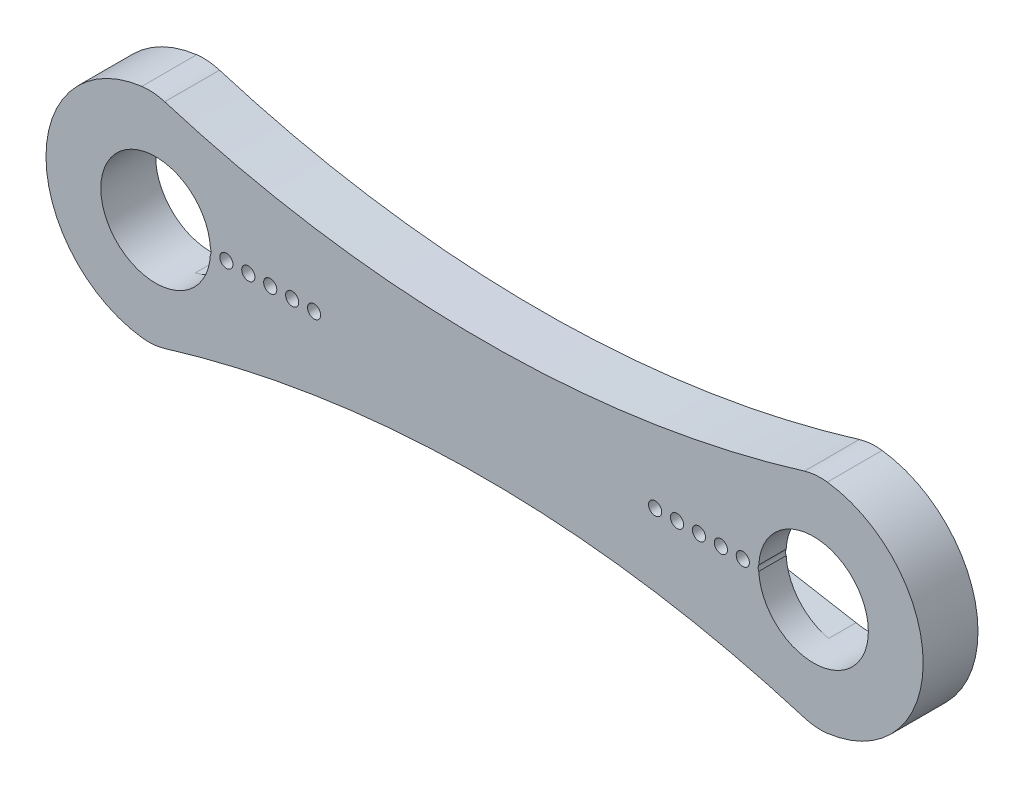
ISO-10303-21;
HEADER;
FILE_DESCRIPTION(('STEP AP214'),'2;1');
FILE_NAME('part.step','',(''),(''),'','','');
FILE_SCHEMA(('AUTOMOTIVE_DESIGN { 1 0 10303 214 1 1 1 1 }'));
ENDSEC;
DATA;
#1=APPLICATION_CONTEXT('core data for automotive mechanical design processes');
#2=APPLICATION_PROTOCOL_DEFINITION('international standard','automotive_design',2000,#1);
#3=PRODUCT_CONTEXT('',#1,'mechanical');
#4=PRODUCT('Part','Part','',(#3));
#5=PRODUCT_RELATED_PRODUCT_CATEGORY('part','',(#4));
#6=PRODUCT_DEFINITION_FORMATION('','',#4);
#7=PRODUCT_DEFINITION_CONTEXT('part definition',#1,'design');
#8=PRODUCT_DEFINITION('design','',#6,#7);
#9=PRODUCT_DEFINITION_SHAPE('','',#8);
#10=(LENGTH_UNIT() NAMED_UNIT(*) SI_UNIT(.MILLI.,.METRE.));
#11=(NAMED_UNIT(*) PLANE_ANGLE_UNIT() SI_UNIT($,.RADIAN.));
#12=(NAMED_UNIT(*) SI_UNIT($,.STERADIAN.) SOLID_ANGLE_UNIT());
#13=UNCERTAINTY_MEASURE_WITH_UNIT(LENGTH_MEASURE(1.E-05),#10,'distance_accuracy_value','');
#14=(GEOMETRIC_REPRESENTATION_CONTEXT(3) GLOBAL_UNCERTAINTY_ASSIGNED_CONTEXT((#13)) GLOBAL_UNIT_ASSIGNED_CONTEXT((#10,
#11,#12)) REPRESENTATION_CONTEXT('',''));
#15=CARTESIAN_POINT('',(0.,0.,0.));
#16=DIRECTION('',(0.,0.,1.));
#17=DIRECTION('',(1.,0.,0.));
#18=AXIS2_PLACEMENT_3D('',#15,#16,#17);
#19=CARTESIAN_POINT('',(60.,0.,5.));
#20=DIRECTION('',(0.,0.,-1.));
#21=DIRECTION('',(-1.,0.,0.));
#22=AXIS2_PLACEMENT_3D('',#19,#20,#21);
#23=CYLINDRICAL_SURFACE('',#22,5.);
#24=DIRECTION('',(0.,0.,-1.));
#25=VECTOR('',#24,1.);
#26=CARTESIAN_POINT('',(55.0064606741573,0.254096440868885,2.5));
#27=LINE('',#26,#25);
#28=CARTESIAN_POINT('',(55.0064606741573,0.254096440868886,5.));
#29=VERTEX_POINT('',#28);
#30=CARTESIAN_POINT('',(55.0064606741573,0.254096440868885,2.5));
#31=VERTEX_POINT('',#30);
#32=EDGE_CURVE('E11',#29,#31,#27,.T.);
#33=ORIENTED_EDGE('',*,*,#32,.T.);
#34=CARTESIAN_POINT('',(60.,0.,2.5));
#35=DIRECTION('',(0.,0.,-1.));
#36=DIRECTION('',(-1.,0.,0.));
#37=AXIS2_PLACEMENT_3D('',#34,#35,#36);
#38=CIRCLE('',#37,5.);
#39=CARTESIAN_POINT('',(59.134948096886,4.92460000456063,2.5));
#40=VERTEX_POINT('',#39);
#41=EDGE_CURVE('E55',#31,#40,#38,.T.);
#42=ORIENTED_EDGE('',*,*,#41,.T.);
#43=DIRECTION('',(0.,0.,-1.));
#44=VECTOR('',#43,1.);
#45=CARTESIAN_POINT('',(59.134948096886,4.92460000456063,2.5));
#46=LINE('',#45,#44);
#47=CARTESIAN_POINT('',(59.134948096886,4.92460000456063,0.));
#48=VERTEX_POINT('',#47);
#49=EDGE_CURVE('E179',#40,#48,#46,.T.);
#50=ORIENTED_EDGE('',*,*,#49,.T.);
#51=CARTESIAN_POINT('',(60.,0.,0.));
#52=DIRECTION('',(0.,0.,1.));
#53=DIRECTION('',(1.,0.,0.));
#54=AXIS2_PLACEMENT_3D('',#51,#52,#53);
#55=CIRCLE('',#54,5.);
#56=CARTESIAN_POINT('',(58.8754325259518,-4.8718936766223,0.));
#57=VERTEX_POINT('',#56);
#58=EDGE_CURVE('E297',#57,#48,#55,.T.);
#59=ORIENTED_EDGE('',*,*,#58,.F.);
#60=DIRECTION('',(0.,0.,-1.));
#61=VECTOR('',#60,1.);
#62=CARTESIAN_POINT('',(58.8754325259518,-4.8718936766223,2.5));
#63=LINE('',#62,#61);
#64=CARTESIAN_POINT('',(58.8754325259518,-4.8718936766223,2.5));
#65=VERTEX_POINT('',#64);
#66=EDGE_CURVE('E187',#65,#57,#63,.T.);
#67=ORIENTED_EDGE('',*,*,#66,.F.);
#68=CARTESIAN_POINT('',(55.0064606741575,-0.254096440869342,2.5));
#69=VERTEX_POINT('',#68);
#70=EDGE_CURVE('E201',#65,#69,#38,.T.);
#71=ORIENTED_EDGE('',*,*,#70,.T.);
#72=DIRECTION('',(0.,0.,-1.));
#73=VECTOR('',#72,1.);
#74=CARTESIAN_POINT('',(55.0064606741573,-0.254096440868886,2.5));
#75=LINE('',#74,#73);
#76=CARTESIAN_POINT('',(55.0064606741573,-0.254096440868887,5.));
#77=VERTEX_POINT('',#76);
#78=EDGE_CURVE('E48',#69,#77,#75,.F.);
#79=ORIENTED_EDGE('',*,*,#78,.T.);
#80=CARTESIAN_POINT('',(60.,0.,5.));
#81=DIRECTION('',(0.,0.,1.));
#82=DIRECTION('',(1.,0.,0.));
#83=AXIS2_PLACEMENT_3D('',#80,#81,#82);
#84=CIRCLE('',#83,5.);
#85=EDGE_CURVE('E318',#77,#29,#84,.T.);
#86=ORIENTED_EDGE('',*,*,#85,.T.);
#87=EDGE_LOOP('',(#33,#42,#50,#59,#67,#71,#79,#86));
#88=FACE_BOUND('',#87,.T.);
#89=ADVANCED_FACE('F39',(#88),#23,.F.);
#90=CARTESIAN_POINT('',(55.5500000000002,0.,5.));
#91=DIRECTION('',(0.,0.,-1.));
#92=DIRECTION('',(-1.,0.,0.));
#93=AXIS2_PLACEMENT_3D('',#90,#91,#92);
#94=CYLINDRICAL_SURFACE('',#93,0.6);
#95=ORIENTED_EDGE('',*,*,#78,.F.);
#96=CARTESIAN_POINT('',(55.5500000000002,0.,2.5));
#97=DIRECTION('',(0.,0.,1.));
#98=DIRECTION('',(1.,0.,0.));
#99=AXIS2_PLACEMENT_3D('',#96,#97,#98);
#100=CIRCLE('',#99,0.6);
#101=EDGE_CURVE('E542',#69,#31,#100,.F.);
#102=ORIENTED_EDGE('',*,*,#101,.T.);
#103=ORIENTED_EDGE('',*,*,#32,.F.);
#104=CARTESIAN_POINT('',(55.5500000000002,0.,5.));
#105=DIRECTION('',(0.,0.,1.));
#106=DIRECTION('',(1.,0.,0.));
#107=AXIS2_PLACEMENT_3D('',#104,#105,#106);
#108=CIRCLE('',#107,0.6);
#109=EDGE_CURVE('E211',#29,#77,#108,.T.);
#110=ORIENTED_EDGE('',*,*,#109,.T.);
#111=EDGE_LOOP('',(#95,#102,#103,#110));
#112=FACE_BOUND('',#111,.T.);
#113=ADVANCED_FACE('F465',(#112),#94,.F.);
#114=CARTESIAN_POINT('',(45.5500000000002,0.,5.));
#115=DIRECTION('',(0.,0.,-1.));
#116=DIRECTION('',(-1.,0.,0.));
#117=AXIS2_PLACEMENT_3D('',#114,#115,#116);
#118=CYLINDRICAL_SURFACE('',#117,0.6);
#119=CARTESIAN_POINT('',(45.5500000000002,0.,5.));
#120=DIRECTION('',(0.,0.,1.));
#121=DIRECTION('',(1.,0.,0.));
#122=AXIS2_PLACEMENT_3D('',#119,#120,#121);
#123=CIRCLE('',#122,0.6);
#124=CARTESIAN_POINT('',(46.1500000000002,0.,5.));
#125=VERTEX_POINT('',#124);
#126=EDGE_CURVE('E200',#125,#125,#123,.T.);
#127=ORIENTED_EDGE('',*,*,#126,.T.);
#128=EDGE_LOOP('',(#127));
#129=FACE_BOUND('',#128,.T.);
#130=CARTESIAN_POINT('',(45.5500000000002,0.,2.5));
#131=DIRECTION('',(0.,0.,1.));
#132=DIRECTION('',(1.,0.,0.));
#133=AXIS2_PLACEMENT_3D('',#130,#131,#132);
#134=CIRCLE('',#133,0.6);
#135=CARTESIAN_POINT('',(46.1500000000002,0.,2.5));
#136=VERTEX_POINT('',#135);
#137=EDGE_CURVE('E188',#136,#136,#134,.F.);
#138=ORIENTED_EDGE('',*,*,#137,.T.);
#139=EDGE_LOOP('',(#138));
#140=FACE_BOUND('',#139,.T.);
#141=ADVANCED_FACE('F470',(#129,#140),#118,.F.);
#142=CARTESIAN_POINT('',(47.5500000000002,0.,5.));
#143=DIRECTION('',(0.,0.,-1.));
#144=DIRECTION('',(-1.,0.,0.));
#145=AXIS2_PLACEMENT_3D('',#142,#143,#144);
#146=CYLINDRICAL_SURFACE('',#145,0.6);
#147=CARTESIAN_POINT('',(47.5500000000002,0.,5.));
#148=DIRECTION('',(0.,0.,1.));
#149=DIRECTION('',(1.,0.,0.));
#150=AXIS2_PLACEMENT_3D('',#147,#148,#149);
#151=CIRCLE('',#150,0.6);
#152=CARTESIAN_POINT('',(48.1500000000002,0.,5.));
#153=VERTEX_POINT('',#152);
#154=EDGE_CURVE('E206',#153,#153,#151,.T.);
#155=ORIENTED_EDGE('',*,*,#154,.T.);
#156=EDGE_LOOP('',(#155));
#157=FACE_BOUND('',#156,.T.);
#158=CARTESIAN_POINT('',(47.5500000000002,0.,2.5));
#159=DIRECTION('',(0.,0.,1.));
#160=DIRECTION('',(1.,0.,0.));
#161=AXIS2_PLACEMENT_3D('',#158,#159,#160);
#162=CIRCLE('',#161,0.6);
#163=CARTESIAN_POINT('',(48.1500000000002,0.,2.5));
#164=VERTEX_POINT('',#163);
#165=EDGE_CURVE('E559',#164,#164,#162,.F.);
#166=ORIENTED_EDGE('',*,*,#165,.T.);
#167=EDGE_LOOP('',(#166));
#168=FACE_BOUND('',#167,.T.);
#169=ADVANCED_FACE('F612',(#157,#168),#146,.F.);
#170=CARTESIAN_POINT('',(49.5500000000002,0.,5.));
#171=DIRECTION('',(0.,0.,-1.));
#172=DIRECTION('',(-1.,0.,0.));
#173=AXIS2_PLACEMENT_3D('',#170,#171,#172);
#174=CYLINDRICAL_SURFACE('',#173,0.6);
#175=CARTESIAN_POINT('',(49.5500000000002,0.,5.));
#176=DIRECTION('',(0.,0.,1.));
#177=DIRECTION('',(1.,0.,0.));
#178=AXIS2_PLACEMENT_3D('',#175,#176,#177);
#179=CIRCLE('',#178,0.6);
#180=CARTESIAN_POINT('',(50.1500000000002,0.,5.));
#181=VERTEX_POINT('',#180);
#182=EDGE_CURVE('E223',#181,#181,#179,.T.);
#183=ORIENTED_EDGE('',*,*,#182,.T.);
#184=EDGE_LOOP('',(#183));
#185=FACE_BOUND('',#184,.T.);
#186=CARTESIAN_POINT('',(49.5500000000002,0.,2.5));
#187=DIRECTION('',(0.,0.,1.));
#188=DIRECTION('',(1.,0.,0.));
#189=AXIS2_PLACEMENT_3D('',#186,#187,#188);
#190=CIRCLE('',#189,0.6);
#191=CARTESIAN_POINT('',(50.1500000000002,0.,2.5));
#192=VERTEX_POINT('',#191);
#193=EDGE_CURVE('E545',#192,#192,#190,.F.);
#194=ORIENTED_EDGE('',*,*,#193,.T.);
#195=EDGE_LOOP('',(#194));
#196=FACE_BOUND('',#195,.T.);
#197=ADVANCED_FACE('F608',(#185,#196),#174,.F.);
#198=CARTESIAN_POINT('',(51.5500000000002,0.,5.));
#199=DIRECTION('',(0.,0.,-1.));
#200=DIRECTION('',(-1.,0.,0.));
#201=AXIS2_PLACEMENT_3D('',#198,#199,#200);
#202=CYLINDRICAL_SURFACE('',#201,0.6);
#203=CARTESIAN_POINT('',(51.5500000000002,0.,5.));
#204=DIRECTION('',(0.,0.,1.));
#205=DIRECTION('',(1.,0.,0.));
#206=AXIS2_PLACEMENT_3D('',#203,#204,#205);
#207=CIRCLE('',#206,0.6);
#208=CARTESIAN_POINT('',(52.1500000000002,0.,5.));
#209=VERTEX_POINT('',#208);
#210=EDGE_CURVE('E219',#209,#209,#207,.T.);
#211=ORIENTED_EDGE('',*,*,#210,.T.);
#212=EDGE_LOOP('',(#211));
#213=FACE_BOUND('',#212,.T.);
#214=CARTESIAN_POINT('',(51.5500000000002,0.,2.5));
#215=DIRECTION('',(0.,0.,1.));
#216=DIRECTION('',(1.,0.,0.));
#217=AXIS2_PLACEMENT_3D('',#214,#215,#216);
#218=CIRCLE('',#217,0.6);
#219=CARTESIAN_POINT('',(52.1500000000002,0.,2.5));
#220=VERTEX_POINT('',#219);
#221=EDGE_CURVE('E550',#220,#220,#218,.F.);
#222=ORIENTED_EDGE('',*,*,#221,.T.);
#223=EDGE_LOOP('',(#222));
#224=FACE_BOUND('',#223,.T.);
#225=ADVANCED_FACE('F604',(#213,#224),#202,.F.);
#226=CARTESIAN_POINT('',(53.5500000000002,0.,5.));
#227=DIRECTION('',(0.,0.,-1.));
#228=DIRECTION('',(-1.,0.,0.));
#229=AXIS2_PLACEMENT_3D('',#226,#227,#228);
#230=CYLINDRICAL_SURFACE('',#229,0.6);
#231=CARTESIAN_POINT('',(53.5500000000002,0.,5.));
#232=DIRECTION('',(0.,0.,1.));
#233=DIRECTION('',(1.,0.,0.));
#234=AXIS2_PLACEMENT_3D('',#231,#232,#233);
#235=CIRCLE('',#234,0.6);
#236=CARTESIAN_POINT('',(54.1500000000002,0.,5.));
#237=VERTEX_POINT('',#236);
#238=EDGE_CURVE('E215',#237,#237,#235,.T.);
#239=ORIENTED_EDGE('',*,*,#238,.T.);
#240=EDGE_LOOP('',(#239));
#241=FACE_BOUND('',#240,.T.);
#242=CARTESIAN_POINT('',(53.5500000000002,0.,2.5));
#243=DIRECTION('',(0.,0.,1.));
#244=DIRECTION('',(1.,0.,0.));
#245=AXIS2_PLACEMENT_3D('',#242,#243,#244);
#246=CIRCLE('',#245,0.6);
#247=CARTESIAN_POINT('',(54.1500000000002,0.,2.5));
#248=VERTEX_POINT('',#247);
#249=EDGE_CURVE('E544',#248,#248,#246,.F.);
#250=ORIENTED_EDGE('',*,*,#249,.T.);
#251=EDGE_LOOP('',(#250));
#252=FACE_BOUND('',#251,.T.);
#253=ADVANCED_FACE('F488',(#241,#252),#230,.F.);
#254=CARTESIAN_POINT('',(45.,52.6969600708473,0.));
#255=DIRECTION('',(0.,0.,1.));
#256=DIRECTION('',(1.,0.,0.));
#257=AXIS2_PLACEMENT_3D('',#254,#255,#256);
#258=PLANE('',#257);
#259=ORIENTED_EDGE('',*,*,#58,.T.);
#260=DIRECTION('',(0.984920000912125,0.173010380622838,0.));
#261=VECTOR('',#260,1.);
#262=CARTESIAN_POINT('',(59.134948096886,4.92460000456063,0.));
#263=LINE('',#262,#261);
#264=CARTESIAN_POINT('',(45.1174740484431,2.46230000228031,0.));
#265=VERTEX_POINT('',#264);
#266=EDGE_CURVE('E183',#265,#48,#263,.T.);
#267=ORIENTED_EDGE('',*,*,#266,.F.);
#268=CARTESIAN_POINT('',(45.5500000000002,0.,0.));
#269=DIRECTION('',(0.,0.,1.));
#270=DIRECTION('',(1.,0.,0.));
#271=AXIS2_PLACEMENT_3D('',#268,#269,#270);
#272=CIRCLE('',#271,2.5);
#273=CARTESIAN_POINT('',(44.987716262976,-2.43594683831115,0.));
#274=VERTEX_POINT('',#273);
#275=EDGE_CURVE('E197',#265,#274,#272,.T.);
#276=ORIENTED_EDGE('',*,*,#275,.T.);
#277=DIRECTION('',(0.984962994587917,-0.172765445886623,0.));
#278=VECTOR('',#277,1.);
#279=CARTESIAN_POINT('',(59.1373957104497,-4.91784280021816,0.));
#280=LINE('',#279,#278);
#281=EDGE_CURVE('E568',#274,#57,#280,.T.);
#282=ORIENTED_EDGE('',*,*,#281,.T.);
#283=EDGE_LOOP('',(#259,#267,#276,#282));
#284=FACE_BOUND('',#283,.T.);
#285=CARTESIAN_POINT('',(30.,105.393920141695,0.));
#286=DIRECTION('',(0.,0.,-1.));
#287=DIRECTION('',(1.,0.,0.));
#288=AXIS2_PLACEMENT_3D('',#285,#286,#287);
#289=CIRCLE('',#288,100.);
#290=CARTESIAN_POINT('',(59.1699040874637,9.74290501102189,0.));
#291=VERTEX_POINT('',#290);
#292=CARTESIAN_POINT('',(0.830095912536532,9.74290501102183,0.));
#293=VERTEX_POINT('',#292);
#294=EDGE_CURVE('E328',#291,#293,#289,.T.);
#295=ORIENTED_EDGE('',*,*,#294,.F.);
#296=CARTESIAN_POINT('',(60.6283992918368,4.96035425448826,0.));
#297=DIRECTION('',(0.,0.,1.));
#298=DIRECTION('',(1.,0.,0.));
#299=AXIS2_PLACEMENT_3D('',#296,#297,#298);
#300=CIRCLE('',#299,5.);
#301=CARTESIAN_POINT('',(61.2567985836737,9.92070850897635,0.));
#302=VERTEX_POINT('',#301);
#303=EDGE_CURVE('E379',#291,#302,#300,.F.);
#304=ORIENTED_EDGE('',*,*,#303,.T.);
#305=CARTESIAN_POINT('',(60.,0.,0.));
#306=DIRECTION('',(0.,0.,1.));
#307=DIRECTION('',(1.,0.,0.));
#308=AXIS2_PLACEMENT_3D('',#305,#306,#307);
#309=CIRCLE('',#308,10.);
#310=CARTESIAN_POINT('',(61.2567985836733,-9.9207085089764,0.));
#311=VERTEX_POINT('',#310);
#312=EDGE_CURVE('E337',#311,#302,#309,.T.);
#313=ORIENTED_EDGE('',*,*,#312,.F.);
#314=CARTESIAN_POINT('',(60.6283992918366,-4.9603542544882,0.));
#315=DIRECTION('',(0.,0.,1.));
#316=DIRECTION('',(1.,0.,0.));
#317=AXIS2_PLACEMENT_3D('',#314,#315,#316);
#318=CIRCLE('',#317,5.);
#319=CARTESIAN_POINT('',(59.1699040874635,-9.74290501102183,0.));
#320=VERTEX_POINT('',#319);
#321=EDGE_CURVE('E376',#311,#320,#318,.F.);
#322=ORIENTED_EDGE('',*,*,#321,.T.);
#323=CARTESIAN_POINT('',(30.,-105.393920141695,0.));
#324=DIRECTION('',(0.,0.,-1.));
#325=DIRECTION('',(-1.,0.,0.));
#326=AXIS2_PLACEMENT_3D('',#323,#324,#325);
#327=CIRCLE('',#326,100.);
#328=CARTESIAN_POINT('',(0.830095912536334,-9.74290501102189,0.));
#329=VERTEX_POINT('',#328);
#330=EDGE_CURVE('E357',#329,#320,#327,.T.);
#331=ORIENTED_EDGE('',*,*,#330,.F.);
#332=CARTESIAN_POINT('',(-0.628399291836847,-4.96035425448826,0.));
#333=DIRECTION('',(0.,0.,1.));
#334=DIRECTION('',(1.,0.,0.));
#335=AXIS2_PLACEMENT_3D('',#332,#333,#334);
#336=CIRCLE('',#335,5.);
#337=CARTESIAN_POINT('',(-1.25679858367367,-9.92070850897635,0.));
#338=VERTEX_POINT('',#337);
#339=EDGE_CURVE('E373',#329,#338,#336,.F.);
#340=ORIENTED_EDGE('',*,*,#339,.T.);
#341=CARTESIAN_POINT('',(0.,0.,0.));
#342=DIRECTION('',(0.,0.,1.));
#343=DIRECTION('',(1.,0.,0.));
#344=AXIS2_PLACEMENT_3D('',#341,#342,#343);
#345=CIRCLE('',#344,10.);
#346=CARTESIAN_POINT('',(-1.25679858367329,9.9207085089764,0.));
#347=VERTEX_POINT('',#346);
#348=EDGE_CURVE('E353',#347,#338,#345,.T.);
#349=ORIENTED_EDGE('',*,*,#348,.F.);
#350=CARTESIAN_POINT('',(-0.628399291836644,4.9603542544882,0.));
#351=DIRECTION('',(0.,0.,1.));
#352=DIRECTION('',(1.,0.,0.));
#353=AXIS2_PLACEMENT_3D('',#350,#351,#352);
#354=CIRCLE('',#353,5.);
#355=EDGE_CURVE('E370',#347,#293,#354,.F.);
#356=ORIENTED_EDGE('',*,*,#355,.T.);
#357=EDGE_LOOP('',(#295,#304,#313,#322,#331,#340,#349,#356));
#358=FACE_BOUND('',#357,.T.);
#359=DIRECTION('',(-0.984920000912125,0.173010380622838,0.));
#360=VECTOR('',#359,1.);
#361=CARTESIAN_POINT('',(0.865051903114188,4.92460000456063,0.));
#362=LINE('',#361,#360);
#363=CARTESIAN_POINT('',(14.8825259515571,2.46230000228031,0.));
#364=VERTEX_POINT('',#363);
#365=CARTESIAN_POINT('',(0.865051903114188,4.92460000456063,0.));
#366=VERTEX_POINT('',#365);
#367=EDGE_CURVE('E214',#364,#366,#362,.T.);
#368=ORIENTED_EDGE('',*,*,#367,.T.);
#369=CARTESIAN_POINT('',(0.,0.,0.));
#370=DIRECTION('',(0.,0.,1.));
#371=DIRECTION('',(1.,0.,0.));
#372=AXIS2_PLACEMENT_3D('',#369,#370,#371);
#373=CIRCLE('',#372,5.);
#374=CARTESIAN_POINT('',(1.12456747404841,-4.8718936766223,0.));
#375=VERTEX_POINT('',#374);
#376=EDGE_CURVE('E321',#366,#375,#373,.T.);
#377=ORIENTED_EDGE('',*,*,#376,.T.);
#378=DIRECTION('',(-0.984962994587917,-0.172765445886623,0.));
#379=VECTOR('',#378,1.);
#380=CARTESIAN_POINT('',(0.862604289550466,-4.91784280021816,0.));
#381=LINE('',#380,#379);
#382=CARTESIAN_POINT('',(15.0122837370242,-2.43594683831115,0.));
#383=VERTEX_POINT('',#382);
#384=EDGE_CURVE('E235',#383,#375,#381,.T.);
#385=ORIENTED_EDGE('',*,*,#384,.F.);
#386=CARTESIAN_POINT('',(14.45,0.,0.));
#387=DIRECTION('',(0.,0.,-1.));
#388=DIRECTION('',(-1.,0.,0.));
#389=AXIS2_PLACEMENT_3D('',#386,#387,#388);
#390=CIRCLE('',#389,2.5);
#391=EDGE_CURVE('E270',#364,#383,#390,.T.);
#392=ORIENTED_EDGE('',*,*,#391,.F.);
#393=EDGE_LOOP('',(#368,#377,#385,#392));
#394=FACE_BOUND('',#393,.T.);
#395=ADVANCED_FACE('F448',(#284,#358,#394),#258,.F.);
#396=CARTESIAN_POINT('',(4.45,0.,5.));
#397=DIRECTION('',(0.,0.,-1.));
#398=DIRECTION('',(-1.,0.,0.));
#399=AXIS2_PLACEMENT_3D('',#396,#397,#398);
#400=CYLINDRICAL_SURFACE('',#399,0.6);
#401=CARTESIAN_POINT('',(4.45,0.,2.5));
#402=DIRECTION('',(0.,0.,-1.));
#403=DIRECTION('',(-1.,0.,0.));
#404=AXIS2_PLACEMENT_3D('',#401,#402,#403);
#405=CIRCLE('',#404,0.6);
#406=CARTESIAN_POINT('',(4.9935393258427,-0.254096440869346,2.5));
#407=VERTEX_POINT('',#406);
#408=CARTESIAN_POINT('',(4.9935393258427,0.254096440869341,2.5));
#409=VERTEX_POINT('',#408);
#410=EDGE_CURVE('E247',#407,#409,#405,.F.);
#411=ORIENTED_EDGE('',*,*,#410,.F.);
#412=DIRECTION('',(0.,0.,-1.));
#413=VECTOR('',#412,1.);
#414=CARTESIAN_POINT('',(4.9935393258427,-0.254096440869346,2.5));
#415=LINE('',#414,#413);
#416=CARTESIAN_POINT('',(4.9935393258427,-0.254096440869342,5.));
#417=VERTEX_POINT('',#416);
#418=EDGE_CURVE('E419',#407,#417,#415,.F.);
#419=ORIENTED_EDGE('',*,*,#418,.T.);
#420=CARTESIAN_POINT('',(4.45,0.,5.));
#421=DIRECTION('',(0.,0.,-1.));
#422=DIRECTION('',(-1.,0.,0.));
#423=AXIS2_PLACEMENT_3D('',#420,#421,#422);
#424=CIRCLE('',#423,0.6);
#425=CARTESIAN_POINT('',(4.9935393258427,0.254096440869341,5.));
#426=VERTEX_POINT('',#425);
#427=EDGE_CURVE('E293',#426,#417,#424,.T.);
#428=ORIENTED_EDGE('',*,*,#427,.F.);
#429=DIRECTION('',(0.,0.,-1.));
#430=VECTOR('',#429,1.);
#431=CARTESIAN_POINT('',(4.9935393258427,0.254096440869345,2.5));
#432=LINE('',#431,#430);
#433=EDGE_CURVE('E415',#426,#409,#432,.T.);
#434=ORIENTED_EDGE('',*,*,#433,.T.);
#435=EDGE_LOOP('',(#411,#419,#428,#434));
#436=FACE_BOUND('',#435,.T.);
#437=ADVANCED_FACE('F434',(#436),#400,.F.);
#438=CARTESIAN_POINT('',(14.45,0.,5.));
#439=DIRECTION('',(0.,0.,-1.));
#440=DIRECTION('',(-1.,0.,0.));
#441=AXIS2_PLACEMENT_3D('',#438,#439,#440);
#442=CYLINDRICAL_SURFACE('',#441,0.6);
#443=CARTESIAN_POINT('',(14.45,0.,5.));
#444=DIRECTION('',(0.,0.,-1.));
#445=DIRECTION('',(-1.,0.,0.));
#446=AXIS2_PLACEMENT_3D('',#443,#444,#445);
#447=CIRCLE('',#446,0.6);
#448=CARTESIAN_POINT('',(13.85,0.,5.));
#449=VERTEX_POINT('',#448);
#450=EDGE_CURVE('E314',#449,#449,#447,.T.);
#451=ORIENTED_EDGE('',*,*,#450,.F.);
#452=EDGE_LOOP('',(#451));
#453=FACE_BOUND('',#452,.T.);
#454=CARTESIAN_POINT('',(14.45,0.,2.5));
#455=DIRECTION('',(0.,0.,-1.));
#456=DIRECTION('',(-1.,0.,0.));
#457=AXIS2_PLACEMENT_3D('',#454,#455,#456);
#458=CIRCLE('',#457,0.6);
#459=CARTESIAN_POINT('',(13.85,0.,2.5));
#460=VERTEX_POINT('',#459);
#461=EDGE_CURVE('E262',#460,#460,#458,.F.);
#462=ORIENTED_EDGE('',*,*,#461,.F.);
#463=EDGE_LOOP('',(#462));
#464=FACE_BOUND('',#463,.T.);
#465=ADVANCED_FACE('F475',(#453,#464),#442,.F.);
#466=CARTESIAN_POINT('',(12.45,0.,5.));
#467=DIRECTION('',(0.,0.,-1.));
#468=DIRECTION('',(-1.,0.,0.));
#469=AXIS2_PLACEMENT_3D('',#466,#467,#468);
#470=CYLINDRICAL_SURFACE('',#469,0.6);
#471=CARTESIAN_POINT('',(12.45,0.,5.));
#472=DIRECTION('',(0.,0.,-1.));
#473=DIRECTION('',(-1.,0.,0.));
#474=AXIS2_PLACEMENT_3D('',#471,#472,#473);
#475=CIRCLE('',#474,0.6);
#476=CARTESIAN_POINT('',(11.85,0.,5.));
#477=VERTEX_POINT('',#476);
#478=EDGE_CURVE('E310',#477,#477,#475,.T.);
#479=ORIENTED_EDGE('',*,*,#478,.F.);
#480=EDGE_LOOP('',(#479));
#481=FACE_BOUND('',#480,.T.);
#482=CARTESIAN_POINT('',(12.45,0.,2.5));
#483=DIRECTION('',(0.,0.,-1.));
#484=DIRECTION('',(-1.,0.,0.));
#485=AXIS2_PLACEMENT_3D('',#482,#483,#484);
#486=CIRCLE('',#485,0.6);
#487=CARTESIAN_POINT('',(11.85,0.,2.5));
#488=VERTEX_POINT('',#487);
#489=EDGE_CURVE('E258',#488,#488,#486,.F.);
#490=ORIENTED_EDGE('',*,*,#489,.F.);
#491=EDGE_LOOP('',(#490));
#492=FACE_BOUND('',#491,.T.);
#493=ADVANCED_FACE('F759',(#481,#492),#470,.F.);
#494=CARTESIAN_POINT('',(10.45,0.,5.));
#495=DIRECTION('',(0.,0.,-1.));
#496=DIRECTION('',(-1.,0.,0.));
#497=AXIS2_PLACEMENT_3D('',#494,#495,#496);
#498=CYLINDRICAL_SURFACE('',#497,0.6);
#499=CARTESIAN_POINT('',(10.45,0.,5.));
#500=DIRECTION('',(0.,0.,-1.));
#501=DIRECTION('',(-1.,0.,0.));
#502=AXIS2_PLACEMENT_3D('',#499,#500,#501);
#503=CIRCLE('',#502,0.6);
#504=CARTESIAN_POINT('',(9.85,0.,5.));
#505=VERTEX_POINT('',#504);
#506=EDGE_CURVE('E306',#505,#505,#503,.T.);
#507=ORIENTED_EDGE('',*,*,#506,.F.);
#508=EDGE_LOOP('',(#507));
#509=FACE_BOUND('',#508,.T.);
#510=CARTESIAN_POINT('',(10.45,0.,2.5));
#511=DIRECTION('',(0.,0.,-1.));
#512=DIRECTION('',(-1.,0.,0.));
#513=AXIS2_PLACEMENT_3D('',#510,#511,#512);
#514=CIRCLE('',#513,0.6);
#515=CARTESIAN_POINT('',(9.85,0.,2.5));
#516=VERTEX_POINT('',#515);
#517=EDGE_CURVE('E243',#516,#516,#514,.F.);
#518=ORIENTED_EDGE('',*,*,#517,.F.);
#519=EDGE_LOOP('',(#518));
#520=FACE_BOUND('',#519,.T.);
#521=ADVANCED_FACE('F749',(#509,#520),#498,.F.);
#522=CARTESIAN_POINT('',(8.45,0.,5.));
#523=DIRECTION('',(0.,0.,-1.));
#524=DIRECTION('',(-1.,0.,0.));
#525=AXIS2_PLACEMENT_3D('',#522,#523,#524);
#526=CYLINDRICAL_SURFACE('',#525,0.6);
#527=CARTESIAN_POINT('',(8.45,0.,5.));
#528=DIRECTION('',(0.,0.,-1.));
#529=DIRECTION('',(-1.,0.,0.));
#530=AXIS2_PLACEMENT_3D('',#527,#528,#529);
#531=CIRCLE('',#530,0.6);
#532=CARTESIAN_POINT('',(7.85,0.,5.));
#533=VERTEX_POINT('',#532);
#534=EDGE_CURVE('E302',#533,#533,#531,.T.);
#535=ORIENTED_EDGE('',*,*,#534,.F.);
#536=EDGE_LOOP('',(#535));
#537=FACE_BOUND('',#536,.T.);
#538=CARTESIAN_POINT('',(8.45,0.,2.5));
#539=DIRECTION('',(0.,0.,-1.));
#540=DIRECTION('',(-1.,0.,0.));
#541=AXIS2_PLACEMENT_3D('',#538,#539,#540);
#542=CIRCLE('',#541,0.6);
#543=CARTESIAN_POINT('',(7.85,0.,2.5));
#544=VERTEX_POINT('',#543);
#545=EDGE_CURVE('E254',#544,#544,#542,.F.);
#546=ORIENTED_EDGE('',*,*,#545,.F.);
#547=EDGE_LOOP('',(#546));
#548=FACE_BOUND('',#547,.T.);
#549=ADVANCED_FACE('F738',(#537,#548),#526,.F.);
#550=CARTESIAN_POINT('',(6.45,0.,5.));
#551=DIRECTION('',(0.,0.,-1.));
#552=DIRECTION('',(-1.,0.,0.));
#553=AXIS2_PLACEMENT_3D('',#550,#551,#552);
#554=CYLINDRICAL_SURFACE('',#553,0.6);
#555=CARTESIAN_POINT('',(6.45,0.,5.));
#556=DIRECTION('',(0.,0.,-1.));
#557=DIRECTION('',(-1.,0.,0.));
#558=AXIS2_PLACEMENT_3D('',#555,#556,#557);
#559=CIRCLE('',#558,0.6);
#560=CARTESIAN_POINT('',(5.85,0.,5.));
#561=VERTEX_POINT('',#560);
#562=EDGE_CURVE('E298',#561,#561,#559,.T.);
#563=ORIENTED_EDGE('',*,*,#562,.F.);
#564=EDGE_LOOP('',(#563));
#565=FACE_BOUND('',#564,.T.);
#566=CARTESIAN_POINT('',(6.45,0.,2.5));
#567=DIRECTION('',(0.,0.,-1.));
#568=DIRECTION('',(-1.,0.,0.));
#569=AXIS2_PLACEMENT_3D('',#566,#567,#568);
#570=CIRCLE('',#569,0.6);
#571=CARTESIAN_POINT('',(5.85,0.,2.5));
#572=VERTEX_POINT('',#571);
#573=EDGE_CURVE('E250',#572,#572,#570,.F.);
#574=ORIENTED_EDGE('',*,*,#573,.F.);
#575=EDGE_LOOP('',(#574));
#576=FACE_BOUND('',#575,.T.);
#577=ADVANCED_FACE('F484',(#565,#576),#554,.F.);
#578=CARTESIAN_POINT('',(45.,52.6969600708473,5.));
#579=DIRECTION('',(0.,0.,1.));
#580=DIRECTION('',(1.,0.,0.));
#581=AXIS2_PLACEMENT_3D('',#578,#579,#580);
#582=PLANE('',#581);
#583=ORIENTED_EDGE('',*,*,#238,.F.);
#584=EDGE_LOOP('',(#583));
#585=FACE_BOUND('',#584,.T.);
#586=ORIENTED_EDGE('',*,*,#210,.F.);
#587=EDGE_LOOP('',(#586));
#588=FACE_BOUND('',#587,.T.);
#589=ORIENTED_EDGE('',*,*,#182,.F.);
#590=EDGE_LOOP('',(#589));
#591=FACE_BOUND('',#590,.T.);
#592=ORIENTED_EDGE('',*,*,#154,.F.);
#593=EDGE_LOOP('',(#592));
#594=FACE_BOUND('',#593,.T.);
#595=ORIENTED_EDGE('',*,*,#126,.F.);
#596=EDGE_LOOP('',(#595));
#597=FACE_BOUND('',#596,.T.);
#598=ORIENTED_EDGE('',*,*,#427,.T.);
#599=CARTESIAN_POINT('',(0.,0.,5.));
#600=DIRECTION('',(0.,0.,1.));
#601=DIRECTION('',(1.,0.,0.));
#602=AXIS2_PLACEMENT_3D('',#599,#600,#601);
#603=CIRCLE('',#602,5.);
#604=EDGE_CURVE('E324',#426,#417,#603,.T.);
#605=ORIENTED_EDGE('',*,*,#604,.F.);
#606=EDGE_LOOP('',(#598,#605));
#607=FACE_BOUND('',#606,.T.);
#608=ORIENTED_EDGE('',*,*,#562,.T.);
#609=EDGE_LOOP('',(#608));
#610=FACE_BOUND('',#609,.T.);
#611=ORIENTED_EDGE('',*,*,#534,.T.);
#612=EDGE_LOOP('',(#611));
#613=FACE_BOUND('',#612,.T.);
#614=ORIENTED_EDGE('',*,*,#506,.T.);
#615=EDGE_LOOP('',(#614));
#616=FACE_BOUND('',#615,.T.);
#617=ORIENTED_EDGE('',*,*,#478,.T.);
#618=EDGE_LOOP('',(#617));
#619=FACE_BOUND('',#618,.T.);
#620=ORIENTED_EDGE('',*,*,#450,.T.);
#621=EDGE_LOOP('',(#620));
#622=FACE_BOUND('',#621,.T.);
#623=CARTESIAN_POINT('',(60.,0.,5.));
#624=DIRECTION('',(0.,0.,1.));
#625=DIRECTION('',(1.,0.,0.));
#626=AXIS2_PLACEMENT_3D('',#623,#624,#625);
#627=CIRCLE('',#626,10.);
#628=CARTESIAN_POINT('',(61.2567985836733,-9.9207085089764,5.));
#629=VERTEX_POINT('',#628);
#630=CARTESIAN_POINT('',(61.2567985836737,9.92070850897635,5.));
#631=VERTEX_POINT('',#630);
#632=EDGE_CURVE('E345',#629,#631,#627,.T.);
#633=ORIENTED_EDGE('',*,*,#632,.T.);
#634=CARTESIAN_POINT('',(60.6283992918368,4.96035425448826,5.));
#635=DIRECTION('',(0.,0.,1.));
#636=DIRECTION('',(1.,0.,0.));
#637=AXIS2_PLACEMENT_3D('',#634,#635,#636);
#638=CIRCLE('',#637,5.);
#639=CARTESIAN_POINT('',(59.1699040874637,9.74290501102189,5.));
#640=VERTEX_POINT('',#639);
#641=EDGE_CURVE('E398',#631,#640,#638,.T.);
#642=ORIENTED_EDGE('',*,*,#641,.T.);
#643=CARTESIAN_POINT('',(30.,105.393920141695,5.));
#644=DIRECTION('',(0.,0.,-1.));
#645=DIRECTION('',(1.,0.,0.));
#646=AXIS2_PLACEMENT_3D('',#643,#644,#645);
#647=CIRCLE('',#646,100.);
#648=CARTESIAN_POINT('',(0.830095912536532,9.74290501102183,5.));
#649=VERTEX_POINT('',#648);
#650=EDGE_CURVE('E332',#640,#649,#647,.T.);
#651=ORIENTED_EDGE('',*,*,#650,.T.);
#652=CARTESIAN_POINT('',(-0.628399291836644,4.9603542544882,5.));
#653=DIRECTION('',(0.,0.,1.));
#654=DIRECTION('',(1.,0.,0.));
#655=AXIS2_PLACEMENT_3D('',#652,#653,#654);
#656=CIRCLE('',#655,5.);
#657=CARTESIAN_POINT('',(-1.25679858367329,9.9207085089764,5.));
#658=VERTEX_POINT('',#657);
#659=EDGE_CURVE('E389',#649,#658,#656,.T.);
#660=ORIENTED_EDGE('',*,*,#659,.T.);
#661=CARTESIAN_POINT('',(0.,0.,5.));
#662=DIRECTION('',(0.,0.,1.));
#663=DIRECTION('',(1.,0.,0.));
#664=AXIS2_PLACEMENT_3D('',#661,#662,#663);
#665=CIRCLE('',#664,10.);
#666=CARTESIAN_POINT('',(-1.25679858367367,-9.92070850897635,5.));
#667=VERTEX_POINT('',#666);
#668=EDGE_CURVE('E336',#658,#667,#665,.T.);
#669=ORIENTED_EDGE('',*,*,#668,.T.);
#670=CARTESIAN_POINT('',(-0.628399291836847,-4.96035425448826,5.));
#671=DIRECTION('',(0.,0.,1.));
#672=DIRECTION('',(1.,0.,0.));
#673=AXIS2_PLACEMENT_3D('',#670,#671,#672);
#674=CIRCLE('',#673,5.);
#675=CARTESIAN_POINT('',(0.830095912536334,-9.74290501102189,5.));
#676=VERTEX_POINT('',#675);
#677=EDGE_CURVE('E392',#667,#676,#674,.T.);
#678=ORIENTED_EDGE('',*,*,#677,.T.);
#679=CARTESIAN_POINT('',(30.,-105.393920141695,5.));
#680=DIRECTION('',(0.,0.,-1.));
#681=DIRECTION('',(-1.,0.,0.));
#682=AXIS2_PLACEMENT_3D('',#679,#680,#681);
#683=CIRCLE('',#682,100.);
#684=CARTESIAN_POINT('',(59.1699040874635,-9.74290501102183,5.));
#685=VERTEX_POINT('',#684);
#686=EDGE_CURVE('E341',#676,#685,#683,.T.);
#687=ORIENTED_EDGE('',*,*,#686,.T.);
#688=CARTESIAN_POINT('',(60.6283992918366,-4.9603542544882,5.));
#689=DIRECTION('',(0.,0.,1.));
#690=DIRECTION('',(1.,0.,0.));
#691=AXIS2_PLACEMENT_3D('',#688,#689,#690);
#692=CIRCLE('',#691,5.);
#693=EDGE_CURVE('E395',#685,#629,#692,.T.);
#694=ORIENTED_EDGE('',*,*,#693,.T.);
#695=EDGE_LOOP('',(#633,#642,#651,#660,#669,#678,#687,#694));
#696=FACE_BOUND('',#695,.T.);
#697=ORIENTED_EDGE('',*,*,#85,.F.);
#698=ORIENTED_EDGE('',*,*,#109,.F.);
#699=EDGE_LOOP('',(#697,#698));
#700=FACE_BOUND('',#699,.T.);
#701=ADVANCED_FACE('F437',(#585,#588,#591,#594,#597,#607,#610,#613,#616,#619,#622,#696,#700),
#582,.T.);
#702=CARTESIAN_POINT('',(30.,105.393920141695,5.));
#703=DIRECTION('',(0.,0.,-1.));
#704=DIRECTION('',(-1.,0.,0.));
#705=AXIS2_PLACEMENT_3D('',#702,#703,#704);
#706=CYLINDRICAL_SURFACE('',#705,100.);
#707=ORIENTED_EDGE('',*,*,#650,.F.);
#708=DIRECTION('',(0.,0.,-1.));
#709=VECTOR('',#708,1.);
#710=CARTESIAN_POINT('',(59.1699040874637,9.74290501102189,5.));
#711=LINE('',#710,#709);
#712=EDGE_CURVE('E366',#640,#291,#711,.T.);
#713=ORIENTED_EDGE('',*,*,#712,.T.);
#714=ORIENTED_EDGE('',*,*,#294,.T.);
#715=DIRECTION('',(0.,0.,-1.));
#716=VECTOR('',#715,1.);
#717=CARTESIAN_POINT('',(0.830095912536532,9.74290501102183,5.));
#718=LINE('',#717,#716);
#719=EDGE_CURVE('E349',#293,#649,#718,.F.);
#720=ORIENTED_EDGE('',*,*,#719,.T.);
#721=EDGE_LOOP('',(#707,#713,#714,#720));
#722=FACE_BOUND('',#721,.T.);
#723=ADVANCED_FACE('F483',(#722),#706,.F.);
#724=CARTESIAN_POINT('',(0.,0.,5.));
#725=DIRECTION('',(0.,0.,-1.));
#726=DIRECTION('',(-1.,0.,0.));
#727=AXIS2_PLACEMENT_3D('',#724,#725,#726);
#728=CYLINDRICAL_SURFACE('',#727,10.);
#729=ORIENTED_EDGE('',*,*,#348,.T.);
#730=DIRECTION('',(0.,0.,-1.));
#731=VECTOR('',#730,1.);
#732=CARTESIAN_POINT('',(-1.25679858367367,-9.92070850897635,5.));
#733=LINE('',#732,#731);
#734=EDGE_CURVE('E412',#338,#667,#733,.F.);
#735=ORIENTED_EDGE('',*,*,#734,.T.);
#736=ORIENTED_EDGE('',*,*,#668,.F.);
#737=DIRECTION('',(0.,0.,-1.));
#738=VECTOR('',#737,1.);
#739=CARTESIAN_POINT('',(-1.25679858367329,9.9207085089764,5.));
#740=LINE('',#739,#738);
#741=EDGE_CURVE('E408',#658,#347,#740,.T.);
#742=ORIENTED_EDGE('',*,*,#741,.T.);
#743=EDGE_LOOP('',(#729,#735,#736,#742));
#744=FACE_BOUND('',#743,.T.);
#745=ADVANCED_FACE('F496',(#744),#728,.T.);
#746=CARTESIAN_POINT('',(30.,-105.393920141695,5.));
#747=DIRECTION('',(0.,0.,-1.));
#748=DIRECTION('',(-1.,0.,0.));
#749=AXIS2_PLACEMENT_3D('',#746,#747,#748);
#750=CYLINDRICAL_SURFACE('',#749,100.);
#751=ORIENTED_EDGE('',*,*,#330,.T.);
#752=DIRECTION('',(0.,0.,-1.));
#753=VECTOR('',#752,1.);
#754=CARTESIAN_POINT('',(59.1699040874635,-9.74290501102182,5.));
#755=LINE('',#754,#753);
#756=EDGE_CURVE('E405',#320,#685,#755,.F.);
#757=ORIENTED_EDGE('',*,*,#756,.T.);
#758=ORIENTED_EDGE('',*,*,#686,.F.);
#759=DIRECTION('',(0.,0.,-1.));
#760=VECTOR('',#759,1.);
#761=CARTESIAN_POINT('',(0.830095912536334,-9.74290501102189,5.));
#762=LINE('',#761,#760);
#763=EDGE_CURVE('E401',#676,#329,#762,.T.);
#764=ORIENTED_EDGE('',*,*,#763,.T.);
#765=EDGE_LOOP('',(#751,#757,#758,#764));
#766=FACE_BOUND('',#765,.T.);
#767=ADVANCED_FACE('F492',(#766),#750,.F.);
#768=CARTESIAN_POINT('',(60.,0.,5.));
#769=DIRECTION('',(0.,0.,-1.));
#770=DIRECTION('',(-1.,0.,0.));
#771=AXIS2_PLACEMENT_3D('',#768,#769,#770);
#772=CYLINDRICAL_SURFACE('',#771,10.);
#773=ORIENTED_EDGE('',*,*,#312,.T.);
#774=DIRECTION('',(0.,0.,-1.));
#775=VECTOR('',#774,1.);
#776=CARTESIAN_POINT('',(61.2567985836737,9.92070850897635,5.));
#777=LINE('',#776,#775);
#778=EDGE_CURVE('E386',#302,#631,#777,.F.);
#779=ORIENTED_EDGE('',*,*,#778,.T.);
#780=ORIENTED_EDGE('',*,*,#632,.F.);
#781=DIRECTION('',(0.,0.,-1.));
#782=VECTOR('',#781,1.);
#783=CARTESIAN_POINT('',(61.2567985836733,-9.9207085089764,5.));
#784=LINE('',#783,#782);
#785=EDGE_CURVE('E382',#629,#311,#784,.T.);
#786=ORIENTED_EDGE('',*,*,#785,.T.);
#787=EDGE_LOOP('',(#773,#779,#780,#786));
#788=FACE_BOUND('',#787,.T.);
#789=ADVANCED_FACE('F480',(#788),#772,.T.);
#790=CARTESIAN_POINT('',(0.,0.,5.));
#791=DIRECTION('',(0.,0.,-1.));
#792=DIRECTION('',(-1.,0.,0.));
#793=AXIS2_PLACEMENT_3D('',#790,#791,#792);
#794=CYLINDRICAL_SURFACE('',#793,5.);
#795=DIRECTION('',(0.,0.,-1.));
#796=VECTOR('',#795,1.);
#797=CARTESIAN_POINT('',(0.865051903114188,4.92460000456063,2.5));
#798=LINE('',#797,#796);
#799=CARTESIAN_POINT('',(0.865051903114188,4.92460000456063,2.5));
#800=VERTEX_POINT('',#799);
#801=EDGE_CURVE('E276',#800,#366,#798,.T.);
#802=ORIENTED_EDGE('',*,*,#801,.F.);
#803=CARTESIAN_POINT('',(0.,0.,2.5));
#804=DIRECTION('',(0.,0.,-1.));
#805=DIRECTION('',(-1.,0.,0.));
#806=AXIS2_PLACEMENT_3D('',#803,#804,#805);
#807=CIRCLE('',#806,5.);
#808=EDGE_CURVE('E292',#800,#409,#807,.T.);
#809=ORIENTED_EDGE('',*,*,#808,.T.);
#810=ORIENTED_EDGE('',*,*,#433,.F.);
#811=ORIENTED_EDGE('',*,*,#604,.T.);
#812=ORIENTED_EDGE('',*,*,#418,.F.);
#813=CARTESIAN_POINT('',(1.12456747404841,-4.8718936766223,2.5));
#814=VERTEX_POINT('',#813);
#815=EDGE_CURVE('E279',#407,#814,#807,.T.);
#816=ORIENTED_EDGE('',*,*,#815,.T.);
#817=DIRECTION('',(0.,0.,-1.));
#818=VECTOR('',#817,1.);
#819=CARTESIAN_POINT('',(1.12456747404841,-4.8718936766223,2.5));
#820=LINE('',#819,#818);
#821=EDGE_CURVE('E280',#814,#375,#820,.T.);
#822=ORIENTED_EDGE('',*,*,#821,.T.);
#823=ORIENTED_EDGE('',*,*,#376,.F.);
#824=EDGE_LOOP('',(#802,#809,#810,#811,#812,#816,#822,#823));
#825=FACE_BOUND('',#824,.T.);
#826=ADVANCED_FACE('F427',(#825),#794,.F.);
#827=CARTESIAN_POINT('',(60.6283992918368,4.96035425448826,5.));
#828=DIRECTION('',(0.,0.,1.));
#829=DIRECTION('',(1.,0.,0.));
#830=AXIS2_PLACEMENT_3D('',#827,#828,#829);
#831=CYLINDRICAL_SURFACE('',#830,5.);
#832=ORIENTED_EDGE('',*,*,#641,.F.);
#833=ORIENTED_EDGE('',*,*,#778,.F.);
#834=ORIENTED_EDGE('',*,*,#303,.F.);
#835=ORIENTED_EDGE('',*,*,#712,.F.);
#836=EDGE_LOOP('',(#832,#833,#834,#835));
#837=FACE_BOUND('',#836,.T.);
#838=ADVANCED_FACE('F479',(#837),#831,.T.);
#839=CARTESIAN_POINT('',(60.6283992918366,-4.9603542544882,5.));
#840=DIRECTION('',(0.,0.,1.));
#841=DIRECTION('',(1.,0.,0.));
#842=AXIS2_PLACEMENT_3D('',#839,#840,#841);
#843=CYLINDRICAL_SURFACE('',#842,5.);
#844=ORIENTED_EDGE('',*,*,#693,.F.);
#845=ORIENTED_EDGE('',*,*,#756,.F.);
#846=ORIENTED_EDGE('',*,*,#321,.F.);
#847=ORIENTED_EDGE('',*,*,#785,.F.);
#848=EDGE_LOOP('',(#844,#845,#846,#847));
#849=FACE_BOUND('',#848,.T.);
#850=ADVANCED_FACE('F506',(#849),#843,.T.);
#851=CARTESIAN_POINT('',(-0.628399291836847,-4.96035425448826,5.));
#852=DIRECTION('',(0.,0.,1.));
#853=DIRECTION('',(1.,0.,0.));
#854=AXIS2_PLACEMENT_3D('',#851,#852,#853);
#855=CYLINDRICAL_SURFACE('',#854,5.);
#856=ORIENTED_EDGE('',*,*,#677,.F.);
#857=ORIENTED_EDGE('',*,*,#734,.F.);
#858=ORIENTED_EDGE('',*,*,#339,.F.);
#859=ORIENTED_EDGE('',*,*,#763,.F.);
#860=EDGE_LOOP('',(#856,#857,#858,#859));
#861=FACE_BOUND('',#860,.T.);
#862=ADVANCED_FACE('F509',(#861),#855,.T.);
#863=CARTESIAN_POINT('',(-0.628399291836644,4.9603542544882,5.));
#864=DIRECTION('',(0.,0.,1.));
#865=DIRECTION('',(1.,0.,0.));
#866=AXIS2_PLACEMENT_3D('',#863,#864,#865);
#867=CYLINDRICAL_SURFACE('',#866,5.);
#868=ORIENTED_EDGE('',*,*,#659,.F.);
#869=ORIENTED_EDGE('',*,*,#719,.F.);
#870=ORIENTED_EDGE('',*,*,#355,.F.);
#871=ORIENTED_EDGE('',*,*,#741,.F.);
#872=EDGE_LOOP('',(#868,#869,#870,#871));
#873=FACE_BOUND('',#872,.T.);
#874=ADVANCED_FACE('F41',(#873),#867,.T.);
#875=CARTESIAN_POINT('',(0.865051903114188,4.92460000456063,2.5));
#876=DIRECTION('',(-0.173010380622838,-0.984920000912125,0.));
#877=DIRECTION('',(0.984920000912125,-0.173010380622838,0.));
#878=AXIS2_PLACEMENT_3D('',#875,#876,#877);
#879=PLANE('',#878);
#880=ORIENTED_EDGE('',*,*,#367,.F.);
#881=DIRECTION('',(0.,0.,-1.));
#882=VECTOR('',#881,1.);
#883=CARTESIAN_POINT('',(14.8825259515571,2.46230000228031,2.5));
#884=LINE('',#883,#882);
#885=CARTESIAN_POINT('',(14.8825259515571,2.46230000228031,2.5));
#886=VERTEX_POINT('',#885);
#887=EDGE_CURVE('E266',#886,#364,#884,.T.);
#888=ORIENTED_EDGE('',*,*,#887,.F.);
#889=DIRECTION('',(-0.984920000912125,0.173010380622838,0.));
#890=VECTOR('',#889,1.);
#891=CARTESIAN_POINT('',(0.865051903114188,4.92460000456063,2.5));
#892=LINE('',#891,#890);
#893=EDGE_CURVE('E230',#886,#800,#892,.T.);
#894=ORIENTED_EDGE('',*,*,#893,.T.);
#895=ORIENTED_EDGE('',*,*,#801,.T.);
#896=EDGE_LOOP('',(#880,#888,#894,#895));
#897=FACE_BOUND('',#896,.T.);
#898=ADVANCED_FACE('F451',(#897),#879,.T.);
#899=CARTESIAN_POINT('',(0.862604289550466,-4.91784280021816,2.5));
#900=DIRECTION('',(0.172765445886623,-0.984962994587917,0.));
#901=DIRECTION('',(0.984962994587917,0.172765445886623,0.));
#902=AXIS2_PLACEMENT_3D('',#899,#900,#901);
#903=PLANE('',#902);
#904=ORIENTED_EDGE('',*,*,#384,.T.);
#905=ORIENTED_EDGE('',*,*,#821,.F.);
#906=DIRECTION('',(-0.984962994587917,-0.172765445886623,0.));
#907=VECTOR('',#906,1.);
#908=CARTESIAN_POINT('',(0.862604289550466,-4.91784280021816,2.5));
#909=LINE('',#908,#907);
#910=CARTESIAN_POINT('',(15.0122837370242,-2.43594683831115,2.5));
#911=VERTEX_POINT('',#910);
#912=EDGE_CURVE('E239',#911,#814,#909,.T.);
#913=ORIENTED_EDGE('',*,*,#912,.F.);
#914=DIRECTION('',(0.,0.,-1.));
#915=VECTOR('',#914,1.);
#916=CARTESIAN_POINT('',(15.0122837370242,-2.43594683831115,2.5));
#917=LINE('',#916,#915);
#918=EDGE_CURVE('E284',#911,#383,#917,.T.);
#919=ORIENTED_EDGE('',*,*,#918,.T.);
#920=EDGE_LOOP('',(#904,#905,#913,#919));
#921=FACE_BOUND('',#920,.T.);
#922=ADVANCED_FACE('F444',(#921),#903,.F.);
#923=CARTESIAN_POINT('',(14.45,0.,2.5));
#924=DIRECTION('',(0.,0.,-1.));
#925=DIRECTION('',(-1.,0.,0.));
#926=AXIS2_PLACEMENT_3D('',#923,#924,#925);
#927=CYLINDRICAL_SURFACE('',#926,2.5);
#928=ORIENTED_EDGE('',*,*,#391,.T.);
#929=ORIENTED_EDGE('',*,*,#918,.F.);
#930=CARTESIAN_POINT('',(14.45,0.,2.5));
#931=DIRECTION('',(0.,0.,-1.));
#932=DIRECTION('',(-1.,0.,0.));
#933=AXIS2_PLACEMENT_3D('',#930,#931,#932);
#934=CIRCLE('',#933,2.5);
#935=EDGE_CURVE('E234',#886,#911,#934,.T.);
#936=ORIENTED_EDGE('',*,*,#935,.F.);
#937=ORIENTED_EDGE('',*,*,#887,.T.);
#938=EDGE_LOOP('',(#928,#929,#936,#937));
#939=FACE_BOUND('',#938,.T.);
#940=ADVANCED_FACE('F453',(#939),#927,.F.);
#941=CARTESIAN_POINT('',(0.,0.,2.5));
#942=DIRECTION('',(0.,0.,-1.));
#943=DIRECTION('',(-1.,0.,0.));
#944=AXIS2_PLACEMENT_3D('',#941,#942,#943);
#945=PLANE('',#944);
#946=ORIENTED_EDGE('',*,*,#517,.T.);
#947=EDGE_LOOP('',(#946));
#948=FACE_BOUND('',#947,.T.);
#949=ORIENTED_EDGE('',*,*,#893,.F.);
#950=ORIENTED_EDGE('',*,*,#935,.T.);
#951=ORIENTED_EDGE('',*,*,#912,.T.);
#952=ORIENTED_EDGE('',*,*,#815,.F.);
#953=ORIENTED_EDGE('',*,*,#410,.T.);
#954=ORIENTED_EDGE('',*,*,#808,.F.);
#955=EDGE_LOOP('',(#949,#950,#951,#952,#953,#954));
#956=FACE_BOUND('',#955,.T.);
#957=ORIENTED_EDGE('',*,*,#573,.T.);
#958=EDGE_LOOP('',(#957));
#959=FACE_BOUND('',#958,.T.);
#960=ORIENTED_EDGE('',*,*,#545,.T.);
#961=EDGE_LOOP('',(#960));
#962=FACE_BOUND('',#961,.T.);
#963=ORIENTED_EDGE('',*,*,#489,.T.);
#964=EDGE_LOOP('',(#963));
#965=FACE_BOUND('',#964,.T.);
#966=ORIENTED_EDGE('',*,*,#461,.T.);
#967=EDGE_LOOP('',(#966));
#968=FACE_BOUND('',#967,.T.);
#969=ADVANCED_FACE('F439',(#948,#956,#959,#962,#965,#968),#945,.T.);
#970=CARTESIAN_POINT('',(59.134948096886,4.92460000456063,2.5));
#971=DIRECTION('',(-0.173010380622838,0.984920000912125,0.));
#972=DIRECTION('',(-0.984920000912125,-0.173010380622838,0.));
#973=AXIS2_PLACEMENT_3D('',#970,#971,#972);
#974=PLANE('',#973);
#975=ORIENTED_EDGE('',*,*,#266,.T.);
#976=ORIENTED_EDGE('',*,*,#49,.F.);
#977=DIRECTION('',(0.984920000912125,0.173010380622838,0.));
#978=VECTOR('',#977,1.);
#979=CARTESIAN_POINT('',(59.134948096886,4.92460000456063,2.5));
#980=LINE('',#979,#978);
#981=CARTESIAN_POINT('',(45.1174740484431,2.46230000228031,2.5));
#982=VERTEX_POINT('',#981);
#983=EDGE_CURVE('E181',#982,#40,#980,.T.);
#984=ORIENTED_EDGE('',*,*,#983,.F.);
#985=DIRECTION('',(0.,0.,-1.));
#986=VECTOR('',#985,1.);
#987=CARTESIAN_POINT('',(45.1174740484431,2.46230000228031,2.5));
#988=LINE('',#987,#986);
#989=EDGE_CURVE('E208',#982,#265,#988,.T.);
#990=ORIENTED_EDGE('',*,*,#989,.T.);
#991=EDGE_LOOP('',(#975,#976,#984,#990));
#992=FACE_BOUND('',#991,.T.);
#993=ADVANCED_FACE('F180',(#992),#974,.F.);
#994=CARTESIAN_POINT('',(45.5500000000002,0.,2.5));
#995=DIRECTION('',(0.,0.,-1.));
#996=DIRECTION('',(-1.,0.,0.));
#997=AXIS2_PLACEMENT_3D('',#994,#995,#996);
#998=CYLINDRICAL_SURFACE('',#997,2.5);
#999=ORIENTED_EDGE('',*,*,#275,.F.);
#1000=ORIENTED_EDGE('',*,*,#989,.F.);
#1001=CARTESIAN_POINT('',(45.5500000000002,0.,2.5));
#1002=DIRECTION('',(0.,0.,1.));
#1003=DIRECTION('',(1.,0.,0.));
#1004=AXIS2_PLACEMENT_3D('',#1001,#1002,#1003);
#1005=CIRCLE('',#1004,2.5);
#1006=CARTESIAN_POINT('',(44.987716262976,-2.43594683831115,2.5));
#1007=VERTEX_POINT('',#1006);
#1008=EDGE_CURVE('E194',#982,#1007,#1005,.T.);
#1009=ORIENTED_EDGE('',*,*,#1008,.T.);
#1010=DIRECTION('',(0.,0.,-1.));
#1011=VECTOR('',#1010,1.);
#1012=CARTESIAN_POINT('',(44.987716262976,-2.43594683831115,2.5));
#1013=LINE('',#1012,#1011);
#1014=EDGE_CURVE('E577',#1007,#274,#1013,.T.);
#1015=ORIENTED_EDGE('',*,*,#1014,.T.);
#1016=EDGE_LOOP('',(#999,#1000,#1009,#1015));
#1017=FACE_BOUND('',#1016,.T.);
#1018=ADVANCED_FACE('F588',(#1017),#998,.F.);
#1019=CARTESIAN_POINT('',(59.1373957104497,-4.91784280021816,2.5));
#1020=DIRECTION('',(0.172765445886623,0.984962994587917,0.));
#1021=DIRECTION('',(-0.984962994587917,0.172765445886623,0.));
#1022=AXIS2_PLACEMENT_3D('',#1019,#1020,#1021);
#1023=PLANE('',#1022);
#1024=ORIENTED_EDGE('',*,*,#281,.F.);
#1025=ORIENTED_EDGE('',*,*,#1014,.F.);
#1026=DIRECTION('',(0.984962994587917,-0.172765445886623,0.));
#1027=VECTOR('',#1026,1.);
#1028=CARTESIAN_POINT('',(59.1373957104497,-4.91784280021816,2.5));
#1029=LINE('',#1028,#1027);
#1030=EDGE_CURVE('E196',#1007,#65,#1029,.T.);
#1031=ORIENTED_EDGE('',*,*,#1030,.T.);
#1032=ORIENTED_EDGE('',*,*,#66,.T.);
#1033=EDGE_LOOP('',(#1024,#1025,#1031,#1032));
#1034=FACE_BOUND('',#1033,.T.);
#1035=ADVANCED_FACE('F584',(#1034),#1023,.T.);
#1036=CARTESIAN_POINT('',(60.0000000000002,0.,2.5));
#1037=DIRECTION('',(0.,0.,-1.));
#1038=DIRECTION('',(1.,0.,0.));
#1039=AXIS2_PLACEMENT_3D('',#1036,#1037,#1038);
#1040=PLANE('',#1039);
#1041=ORIENTED_EDGE('',*,*,#101,.F.);
#1042=ORIENTED_EDGE('',*,*,#70,.F.);
#1043=ORIENTED_EDGE('',*,*,#1030,.F.);
#1044=ORIENTED_EDGE('',*,*,#1008,.F.);
#1045=ORIENTED_EDGE('',*,*,#983,.T.);
#1046=ORIENTED_EDGE('',*,*,#41,.F.);
#1047=EDGE_LOOP('',(#1041,#1042,#1043,#1044,#1045,#1046));
#1048=FACE_BOUND('',#1047,.T.);
#1049=ORIENTED_EDGE('',*,*,#193,.F.);
#1050=EDGE_LOOP('',(#1049));
#1051=FACE_BOUND('',#1050,.T.);
#1052=ORIENTED_EDGE('',*,*,#249,.F.);
#1053=EDGE_LOOP('',(#1052));
#1054=FACE_BOUND('',#1053,.T.);
#1055=ORIENTED_EDGE('',*,*,#221,.F.);
#1056=EDGE_LOOP('',(#1055));
#1057=FACE_BOUND('',#1056,.T.);
#1058=ORIENTED_EDGE('',*,*,#165,.F.);
#1059=EDGE_LOOP('',(#1058));
#1060=FACE_BOUND('',#1059,.T.);
#1061=ORIENTED_EDGE('',*,*,#137,.F.);
#1062=EDGE_LOOP('',(#1061));
#1063=FACE_BOUND('',#1062,.T.);
#1064=ADVANCED_FACE('F191',(#1048,#1051,#1054,#1057,#1060,#1063),#1040,.T.);
#1065=CLOSED_SHELL('',(#89,#113,#141,#169,#197,#225,#253,#395,#437,#465,#493,#521,#549,#577,
#701,#723,#745,#767,#789,#826,#838,#850,#862,#874,#898,#922,#940,#969,#993,#1018,#1035,#1064));
#1066=MANIFOLD_SOLID_BREP('B2',#1065);
#1067=ADVANCED_BREP_SHAPE_REPRESENTATION('',(#18,#1066),#14);
#1068=SHAPE_DEFINITION_REPRESENTATION(#9,#1067);
ENDSEC;
END-ISO-10303-21;
